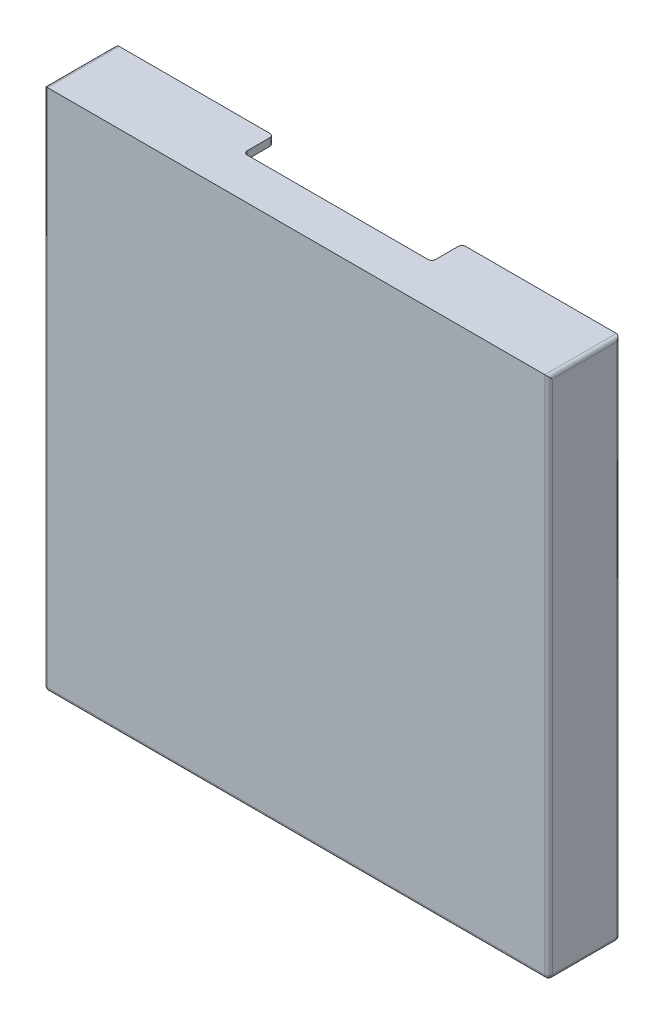
ISO-10303-21;
HEADER;
FILE_DESCRIPTION(('STEP AP214'),'2;1');
FILE_NAME('part.step','',(''),(''),'','','');
FILE_SCHEMA(('AUTOMOTIVE_DESIGN { 1 0 10303 214 1 1 1 1 }'));
ENDSEC;
DATA;
#1=APPLICATION_CONTEXT('core data for automotive mechanical design processes');
#2=APPLICATION_PROTOCOL_DEFINITION('international standard','automotive_design',2000,#1);
#3=PRODUCT_CONTEXT('',#1,'mechanical');
#4=PRODUCT('Part','Part','',(#3));
#5=PRODUCT_RELATED_PRODUCT_CATEGORY('part','',(#4));
#6=PRODUCT_DEFINITION_FORMATION('','',#4);
#7=PRODUCT_DEFINITION_CONTEXT('part definition',#1,'design');
#8=PRODUCT_DEFINITION('design','',#6,#7);
#9=PRODUCT_DEFINITION_SHAPE('','',#8);
#10=(LENGTH_UNIT() NAMED_UNIT(*) SI_UNIT(.MILLI.,.METRE.));
#11=(NAMED_UNIT(*) PLANE_ANGLE_UNIT() SI_UNIT($,.RADIAN.));
#12=(NAMED_UNIT(*) SI_UNIT($,.STERADIAN.) SOLID_ANGLE_UNIT());
#13=UNCERTAINTY_MEASURE_WITH_UNIT(LENGTH_MEASURE(1.E-05),#10,'distance_accuracy_value','');
#14=(GEOMETRIC_REPRESENTATION_CONTEXT(3) GLOBAL_UNCERTAINTY_ASSIGNED_CONTEXT((#13)) GLOBAL_UNIT_ASSIGNED_CONTEXT((#10,
#11,#12)) REPRESENTATION_CONTEXT('',''));
#15=CARTESIAN_POINT('',(0.,0.,0.));
#16=DIRECTION('',(0.,0.,1.));
#17=DIRECTION('',(1.,0.,0.));
#18=AXIS2_PLACEMENT_3D('',#15,#16,#17);
#19=CARTESIAN_POINT('',(-134.,278.,19.));
#20=DIRECTION('',(1.,0.,0.));
#21=DIRECTION('',(0.,0.,-1.));
#22=AXIS2_PLACEMENT_3D('',#19,#20,#21);
#23=PLANE('',#22);
#24=DIRECTION('',(0.,-1.,0.));
#25=VECTOR('',#24,1.);
#26=CARTESIAN_POINT('',(-134.,278.,17.));
#27=LINE('',#26,#25);
#28=CARTESIAN_POINT('',(-134.,2.,17.));
#29=VERTEX_POINT('',#28);
#30=CARTESIAN_POINT('',(-134.,276.,17.));
#31=VERTEX_POINT('',#30);
#32=EDGE_CURVE('E285',#29,#31,#27,.F.);
#33=ORIENTED_EDGE('',*,*,#32,.T.);
#34=DIRECTION('',(0.,0.,1.));
#35=VECTOR('',#34,1.);
#36=CARTESIAN_POINT('',(-134.,276.,-19.));
#37=LINE('',#36,#35);
#38=CARTESIAN_POINT('',(-134.,276.,-17.));
#39=VERTEX_POINT('',#38);
#40=EDGE_CURVE('E291',#31,#39,#37,.F.);
#41=ORIENTED_EDGE('',*,*,#40,.T.);
#42=DIRECTION('',(0.,-1.,0.));
#43=VECTOR('',#42,1.);
#44=CARTESIAN_POINT('',(-134.,278.,-17.));
#45=LINE('',#44,#43);
#46=CARTESIAN_POINT('',(-134.,2.,-17.));
#47=VERTEX_POINT('',#46);
#48=EDGE_CURVE('E288',#39,#47,#45,.T.);
#49=ORIENTED_EDGE('',*,*,#48,.T.);
#50=DIRECTION('',(0.,0.,1.));
#51=VECTOR('',#50,1.);
#52=CARTESIAN_POINT('',(-134.,2.,19.));
#53=LINE('',#52,#51);
#54=EDGE_CURVE('E282',#47,#29,#53,.T.);
#55=ORIENTED_EDGE('',*,*,#54,.T.);
#56=EDGE_LOOP('',(#33,#41,#49,#55));
#57=FACE_BOUND('',#56,.T.);
#58=ADVANCED_FACE('F47',(#57),#23,.F.);
#59=CARTESIAN_POINT('',(134.,278.,19.));
#60=DIRECTION('',(0.,0.,-1.));
#61=DIRECTION('',(-1.,0.,0.));
#62=AXIS2_PLACEMENT_3D('',#59,#60,#61);
#63=PLANE('',#62);
#64=DIRECTION('',(1.,0.,0.));
#65=VECTOR('',#64,1.);
#66=CARTESIAN_POINT('',(134.,278.,19.));
#67=LINE('',#66,#65);
#68=CARTESIAN_POINT('',(-132.,278.,19.));
#69=VERTEX_POINT('',#68);
#70=CARTESIAN_POINT('',(132.,278.,19.));
#71=VERTEX_POINT('',#70);
#72=EDGE_CURVE('E246',#69,#71,#67,.T.);
#73=ORIENTED_EDGE('',*,*,#72,.F.);
#74=DIRECTION('',(0.,-1.,0.));
#75=VECTOR('',#74,1.);
#76=CARTESIAN_POINT('',(-132.,278.,19.));
#77=LINE('',#76,#75);
#78=CARTESIAN_POINT('',(-132.,2.,19.));
#79=VERTEX_POINT('',#78);
#80=EDGE_CURVE('E70',#69,#79,#77,.T.);
#81=ORIENTED_EDGE('',*,*,#80,.T.);
#82=DIRECTION('',(1.,0.,0.));
#83=VECTOR('',#82,1.);
#84=CARTESIAN_POINT('',(134.,2.,19.));
#85=LINE('',#84,#83);
#86=CARTESIAN_POINT('',(132.,2.,19.));
#87=VERTEX_POINT('',#86);
#88=EDGE_CURVE('E65',#79,#87,#85,.T.);
#89=ORIENTED_EDGE('',*,*,#88,.T.);
#90=DIRECTION('',(0.,-1.,0.));
#91=VECTOR('',#90,1.);
#92=CARTESIAN_POINT('',(132.,278.,19.));
#93=LINE('',#92,#91);
#94=EDGE_CURVE('E353',#87,#71,#93,.F.);
#95=ORIENTED_EDGE('',*,*,#94,.T.);
#96=EDGE_LOOP('',(#73,#81,#89,#95));
#97=FACE_BOUND('',#96,.T.);
#98=ADVANCED_FACE('F541',(#97),#63,.F.);
#99=CARTESIAN_POINT('',(134.,278.,19.));
#100=DIRECTION('',(-1.,0.,0.));
#101=DIRECTION('',(0.,0.,1.));
#102=AXIS2_PLACEMENT_3D('',#99,#100,#101);
#103=PLANE('',#102);
#104=DIRECTION('',(0.,-1.,0.));
#105=VECTOR('',#104,1.);
#106=CARTESIAN_POINT('',(134.,278.,-17.));
#107=LINE('',#106,#105);
#108=CARTESIAN_POINT('',(134.,2.,-17.));
#109=VERTEX_POINT('',#108);
#110=CARTESIAN_POINT('',(134.,276.,-17.));
#111=VERTEX_POINT('',#110);
#112=EDGE_CURVE('E275',#109,#111,#107,.F.);
#113=ORIENTED_EDGE('',*,*,#112,.T.);
#114=DIRECTION('',(0.,0.,-1.));
#115=VECTOR('',#114,1.);
#116=CARTESIAN_POINT('',(134.,276.,19.));
#117=LINE('',#116,#115);
#118=CARTESIAN_POINT('',(134.,276.,17.));
#119=VERTEX_POINT('',#118);
#120=EDGE_CURVE('E278',#111,#119,#117,.F.);
#121=ORIENTED_EDGE('',*,*,#120,.T.);
#122=DIRECTION('',(0.,-1.,0.));
#123=VECTOR('',#122,1.);
#124=CARTESIAN_POINT('',(134.,278.,17.));
#125=LINE('',#124,#123);
#126=CARTESIAN_POINT('',(134.,2.,17.));
#127=VERTEX_POINT('',#126);
#128=EDGE_CURVE('E272',#119,#127,#125,.T.);
#129=ORIENTED_EDGE('',*,*,#128,.T.);
#130=DIRECTION('',(0.,0.,-1.));
#131=VECTOR('',#130,1.);
#132=CARTESIAN_POINT('',(134.,2.,19.));
#133=LINE('',#132,#131);
#134=EDGE_CURVE('E269',#127,#109,#133,.T.);
#135=ORIENTED_EDGE('',*,*,#134,.T.);
#136=EDGE_LOOP('',(#113,#121,#129,#135));
#137=FACE_BOUND('',#136,.T.);
#138=ADVANCED_FACE('F559',(#137),#103,.F.);
#139=CARTESIAN_POINT('',(134.,278.,-19.));
#140=DIRECTION('',(0.,0.,1.));
#141=DIRECTION('',(1.,0.,0.));
#142=AXIS2_PLACEMENT_3D('',#139,#140,#141);
#143=PLANE('',#142);
#144=DIRECTION('',(-1.,0.,0.));
#145=VECTOR('',#144,1.);
#146=CARTESIAN_POINT('',(134.,278.,-19.));
#147=LINE('',#146,#145);
#148=CARTESIAN_POINT('',(132.,278.,-19.));
#149=VERTEX_POINT('',#148);
#150=CARTESIAN_POINT('',(52.,278.,-19.));
#151=VERTEX_POINT('',#150);
#152=EDGE_CURVE('E252',#149,#151,#147,.T.);
#153=ORIENTED_EDGE('',*,*,#152,.F.);
#154=DIRECTION('',(0.,-1.,0.));
#155=VECTOR('',#154,1.);
#156=CARTESIAN_POINT('',(132.,278.,-19.));
#157=LINE('',#156,#155);
#158=CARTESIAN_POINT('',(132.,2.,-19.));
#159=VERTEX_POINT('',#158);
#160=EDGE_CURVE('E308',#149,#159,#157,.T.);
#161=ORIENTED_EDGE('',*,*,#160,.T.);
#162=DIRECTION('',(-1.,0.,0.));
#163=VECTOR('',#162,1.);
#164=CARTESIAN_POINT('',(134.,2.,-19.));
#165=LINE('',#164,#163);
#166=CARTESIAN_POINT('',(-132.,2.,-19.));
#167=VERTEX_POINT('',#166);
#168=EDGE_CURVE('E305',#159,#167,#165,.T.);
#169=ORIENTED_EDGE('',*,*,#168,.T.);
#170=DIRECTION('',(0.,-1.,0.));
#171=VECTOR('',#170,1.);
#172=CARTESIAN_POINT('',(-132.,278.,-19.));
#173=LINE('',#172,#171);
#174=CARTESIAN_POINT('',(-132.,278.,-19.));
#175=VERTEX_POINT('',#174);
#176=EDGE_CURVE('E302',#167,#175,#173,.F.);
#177=ORIENTED_EDGE('',*,*,#176,.T.);
#178=CARTESIAN_POINT('',(-52.,278.,-19.));
#179=VERTEX_POINT('',#178);
#180=EDGE_CURVE('E251',#179,#175,#147,.T.);
#181=ORIENTED_EDGE('',*,*,#180,.F.);
#182=DIRECTION('',(0.,1.,0.));
#183=VECTOR('',#182,1.);
#184=CARTESIAN_POINT('',(-52.,278.,-19.));
#185=LINE('',#184,#183);
#186=CARTESIAN_POINT('',(-52.,274.,-19.));
#187=VERTEX_POINT('',#186);
#188=EDGE_CURVE('E295',#179,#187,#185,.F.);
#189=ORIENTED_EDGE('',*,*,#188,.T.);
#190=DIRECTION('',(1.,0.,0.));
#191=VECTOR('',#190,1.);
#192=CARTESIAN_POINT('',(-130.,274.,-19.));
#193=LINE('',#192,#191);
#194=CARTESIAN_POINT('',(-130.,274.,-19.));
#195=VERTEX_POINT('',#194);
#196=EDGE_CURVE('E226',#195,#187,#193,.T.);
#197=ORIENTED_EDGE('',*,*,#196,.F.);
#198=DIRECTION('',(0.,1.,0.));
#199=VECTOR('',#198,1.);
#200=CARTESIAN_POINT('',(-130.,4.,-19.));
#201=LINE('',#200,#199);
#202=CARTESIAN_POINT('',(-130.,4.,-19.));
#203=VERTEX_POINT('',#202);
#204=EDGE_CURVE('E203',#203,#195,#201,.T.);
#205=ORIENTED_EDGE('',*,*,#204,.F.);
#206=DIRECTION('',(-1.,0.,0.));
#207=VECTOR('',#206,1.);
#208=CARTESIAN_POINT('',(130.,4.,-19.));
#209=LINE('',#208,#207);
#210=CARTESIAN_POINT('',(130.,4.,-19.));
#211=VERTEX_POINT('',#210);
#212=EDGE_CURVE('E215',#211,#203,#209,.T.);
#213=ORIENTED_EDGE('',*,*,#212,.F.);
#214=DIRECTION('',(0.,-1.,0.));
#215=VECTOR('',#214,1.);
#216=CARTESIAN_POINT('',(130.,274.,-19.));
#217=LINE('',#216,#215);
#218=CARTESIAN_POINT('',(130.,274.,-19.));
#219=VERTEX_POINT('',#218);
#220=EDGE_CURVE('E221',#219,#211,#217,.T.);
#221=ORIENTED_EDGE('',*,*,#220,.F.);
#222=CARTESIAN_POINT('',(52.,274.,-19.));
#223=VERTEX_POINT('',#222);
#224=EDGE_CURVE('E228',#223,#219,#193,.T.);
#225=ORIENTED_EDGE('',*,*,#224,.F.);
#226=DIRECTION('',(0.,1.,0.));
#227=VECTOR('',#226,1.);
#228=CARTESIAN_POINT('',(52.,278.,-19.));
#229=LINE('',#228,#227);
#230=EDGE_CURVE('E298',#223,#151,#229,.T.);
#231=ORIENTED_EDGE('',*,*,#230,.T.);
#232=EDGE_LOOP('',(#153,#161,#169,#177,#181,#189,#197,#205,#213,#221,#225,#231));
#233=FACE_BOUND('',#232,.T.);
#234=ADVANCED_FACE('F224',(#233),#143,.F.);
#235=CARTESIAN_POINT('',(0.,278.,0.));
#236=DIRECTION('',(0.,1.,0.));
#237=DIRECTION('',(0.,0.,1.));
#238=AXIS2_PLACEMENT_3D('',#235,#236,#237);
#239=PLANE('',#238);
#240=ORIENTED_EDGE('',*,*,#72,.T.);
#241=DIRECTION('',(0.,0.,-1.));
#242=VECTOR('',#241,1.);
#243=CARTESIAN_POINT('',(132.,278.,-19.));
#244=LINE('',#243,#242);
#245=EDGE_CURVE('E265',#71,#149,#244,.T.);
#246=ORIENTED_EDGE('',*,*,#245,.T.);
#247=ORIENTED_EDGE('',*,*,#152,.T.);
#248=CARTESIAN_POINT('',(52.,278.,-17.));
#249=DIRECTION('',(0.,1.,0.));
#250=DIRECTION('',(0.,0.,1.));
#251=AXIS2_PLACEMENT_3D('',#248,#249,#250);
#252=CIRCLE('',#251,2.);
#253=CARTESIAN_POINT('',(50.,278.,-17.));
#254=VERTEX_POINT('',#253);
#255=EDGE_CURVE('E259',#151,#254,#252,.T.);
#256=ORIENTED_EDGE('',*,*,#255,.T.);
#257=DIRECTION('',(0.,0.,-1.));
#258=VECTOR('',#257,1.);
#259=CARTESIAN_POINT('',(50.,278.,-19.));
#260=LINE('',#259,#258);
#261=CARTESIAN_POINT('',(50.,278.,-4.99999999999997));
#262=VERTEX_POINT('',#261);
#263=EDGE_CURVE('E449',#262,#254,#260,.T.);
#264=ORIENTED_EDGE('',*,*,#263,.F.);
#265=CARTESIAN_POINT('',(48.,278.,-4.99999999999998));
#266=DIRECTION('',(0.,1.,0.));
#267=DIRECTION('',(0.,0.,1.));
#268=AXIS2_PLACEMENT_3D('',#265,#266,#267);
#269=CIRCLE('',#268,2.);
#270=CARTESIAN_POINT('',(48.,278.,-2.99999999999998));
#271=VERTEX_POINT('',#270);
#272=EDGE_CURVE('E57',#262,#271,#269,.F.);
#273=ORIENTED_EDGE('',*,*,#272,.T.);
#274=DIRECTION('',(1.,0.,0.));
#275=VECTOR('',#274,1.);
#276=CARTESIAN_POINT('',(-50.,278.,-2.99999999999999));
#277=LINE('',#276,#275);
#278=CARTESIAN_POINT('',(-48.,278.,-2.99999999999999));
#279=VERTEX_POINT('',#278);
#280=EDGE_CURVE('E445',#279,#271,#277,.T.);
#281=ORIENTED_EDGE('',*,*,#280,.F.);
#282=CARTESIAN_POINT('',(-48.,278.,-4.99999999999999));
#283=DIRECTION('',(0.,1.,0.));
#284=DIRECTION('',(0.,0.,1.));
#285=AXIS2_PLACEMENT_3D('',#282,#283,#284);
#286=CIRCLE('',#285,2.);
#287=CARTESIAN_POINT('',(-50.,278.,-4.99999999999999));
#288=VERTEX_POINT('',#287);
#289=EDGE_CURVE('E358',#279,#288,#286,.F.);
#290=ORIENTED_EDGE('',*,*,#289,.T.);
#291=DIRECTION('',(0.,0.,1.));
#292=VECTOR('',#291,1.);
#293=CARTESIAN_POINT('',(-50.,278.,-19.));
#294=LINE('',#293,#292);
#295=CARTESIAN_POINT('',(-50.,278.,-17.));
#296=VERTEX_POINT('',#295);
#297=EDGE_CURVE('E439',#296,#288,#294,.T.);
#298=ORIENTED_EDGE('',*,*,#297,.F.);
#299=CARTESIAN_POINT('',(-52.,278.,-17.));
#300=DIRECTION('',(0.,1.,0.));
#301=DIRECTION('',(0.,0.,1.));
#302=AXIS2_PLACEMENT_3D('',#299,#300,#301);
#303=CIRCLE('',#302,2.);
#304=EDGE_CURVE('E256',#296,#179,#303,.T.);
#305=ORIENTED_EDGE('',*,*,#304,.T.);
#306=ORIENTED_EDGE('',*,*,#180,.T.);
#307=DIRECTION('',(0.,0.,1.));
#308=VECTOR('',#307,1.);
#309=CARTESIAN_POINT('',(-132.,278.,19.));
#310=LINE('',#309,#308);
#311=EDGE_CURVE('E262',#175,#69,#310,.T.);
#312=ORIENTED_EDGE('',*,*,#311,.T.);
#313=EDGE_LOOP('',(#240,#246,#247,#256,#264,#273,#281,#290,#298,#305,#306,#312));
#314=FACE_BOUND('',#313,.T.);
#315=ADVANCED_FACE('F476',(#314),#239,.T.);
#316=CARTESIAN_POINT('',(0.,0.,0.));
#317=DIRECTION('',(0.,1.,0.));
#318=DIRECTION('',(0.,0.,1.));
#319=AXIS2_PLACEMENT_3D('',#316,#317,#318);
#320=PLANE('',#319);
#321=DIRECTION('',(-1.,0.,0.));
#322=VECTOR('',#321,1.);
#323=CARTESIAN_POINT('',(0.,0.,-17.));
#324=LINE('',#323,#322);
#325=CARTESIAN_POINT('',(-132.,0.,-17.));
#326=VERTEX_POINT('',#325);
#327=CARTESIAN_POINT('',(132.,0.,-17.));
#328=VERTEX_POINT('',#327);
#329=EDGE_CURVE('E317',#326,#328,#324,.F.);
#330=ORIENTED_EDGE('',*,*,#329,.T.);
#331=DIRECTION('',(0.,0.,-1.));
#332=VECTOR('',#331,1.);
#333=CARTESIAN_POINT('',(132.,0.,0.));
#334=LINE('',#333,#332);
#335=CARTESIAN_POINT('',(132.,0.,17.));
#336=VERTEX_POINT('',#335);
#337=EDGE_CURVE('E321',#328,#336,#334,.F.);
#338=ORIENTED_EDGE('',*,*,#337,.T.);
#339=DIRECTION('',(1.,0.,0.));
#340=VECTOR('',#339,1.);
#341=CARTESIAN_POINT('',(0.,0.,17.));
#342=LINE('',#341,#340);
#343=CARTESIAN_POINT('',(-132.,0.,17.));
#344=VERTEX_POINT('',#343);
#345=EDGE_CURVE('E314',#336,#344,#342,.F.);
#346=ORIENTED_EDGE('',*,*,#345,.T.);
#347=DIRECTION('',(0.,0.,1.));
#348=VECTOR('',#347,1.);
#349=CARTESIAN_POINT('',(-132.,0.,0.));
#350=LINE('',#349,#348);
#351=EDGE_CURVE('E311',#344,#326,#350,.F.);
#352=ORIENTED_EDGE('',*,*,#351,.T.);
#353=EDGE_LOOP('',(#330,#338,#346,#352));
#354=FACE_BOUND('',#353,.T.);
#355=ADVANCED_FACE('F516',(#354),#320,.F.);
#356=CARTESIAN_POINT('',(130.,274.,393.833296279826));
#357=DIRECTION('',(1.,0.,0.));
#358=DIRECTION('',(0.,0.,-1.));
#359=AXIS2_PLACEMENT_3D('',#356,#357,#358);
#360=PLANE('',#359);
#361=DIRECTION('',(0.,1.,0.));
#362=VECTOR('',#361,1.);
#363=CARTESIAN_POINT('',(130.,274.,17.));
#364=LINE('',#363,#362);
#365=CARTESIAN_POINT('',(130.,4.,17.));
#366=VERTEX_POINT('',#365);
#367=CARTESIAN_POINT('',(130.,274.,17.));
#368=VERTEX_POINT('',#367);
#369=EDGE_CURVE('E247',#366,#368,#364,.T.);
#370=ORIENTED_EDGE('',*,*,#369,.T.);
#371=DIRECTION('',(0.,0.,-1.));
#372=VECTOR('',#371,1.);
#373=CARTESIAN_POINT('',(130.,274.,393.833296279826));
#374=LINE('',#373,#372);
#375=EDGE_CURVE('E235',#368,#219,#374,.T.);
#376=ORIENTED_EDGE('',*,*,#375,.T.);
#377=ORIENTED_EDGE('',*,*,#220,.T.);
#378=DIRECTION('',(0.,0.,-1.));
#379=VECTOR('',#378,1.);
#380=CARTESIAN_POINT('',(130.,4.,393.833296279826));
#381=LINE('',#380,#379);
#382=EDGE_CURVE('E211',#366,#211,#381,.T.);
#383=ORIENTED_EDGE('',*,*,#382,.F.);
#384=EDGE_LOOP('',(#370,#376,#377,#383));
#385=FACE_BOUND('',#384,.T.);
#386=ADVANCED_FACE('F465',(#385),#360,.F.);
#387=CARTESIAN_POINT('',(-130.,274.,393.833296279826));
#388=DIRECTION('',(0.,1.,0.));
#389=DIRECTION('',(0.,0.,1.));
#390=AXIS2_PLACEMENT_3D('',#387,#388,#389);
#391=PLANE('',#390);
#392=DIRECTION('',(0.,0.,1.));
#393=VECTOR('',#392,1.);
#394=CARTESIAN_POINT('',(50.,274.,-19.));
#395=LINE('',#394,#393);
#396=CARTESIAN_POINT('',(50.,274.,-17.));
#397=VERTEX_POINT('',#396);
#398=CARTESIAN_POINT('',(50.,274.,-4.99999999999997));
#399=VERTEX_POINT('',#398);
#400=EDGE_CURVE('E426',#397,#399,#395,.T.);
#401=ORIENTED_EDGE('',*,*,#400,.F.);
#402=CARTESIAN_POINT('',(52.,274.,-17.));
#403=DIRECTION('',(0.,1.,0.));
#404=DIRECTION('',(0.,0.,1.));
#405=AXIS2_PLACEMENT_3D('',#402,#403,#404);
#406=CIRCLE('',#405,2.);
#407=EDGE_CURVE('E348',#397,#223,#406,.F.);
#408=ORIENTED_EDGE('',*,*,#407,.T.);
#409=ORIENTED_EDGE('',*,*,#224,.T.);
#410=ORIENTED_EDGE('',*,*,#375,.F.);
#411=DIRECTION('',(-1.,0.,0.));
#412=VECTOR('',#411,1.);
#413=CARTESIAN_POINT('',(-130.,274.,17.));
#414=LINE('',#413,#412);
#415=CARTESIAN_POINT('',(-130.,274.,17.));
#416=VERTEX_POINT('',#415);
#417=EDGE_CURVE('E459',#368,#416,#414,.T.);
#418=ORIENTED_EDGE('',*,*,#417,.T.);
#419=DIRECTION('',(0.,0.,-1.));
#420=VECTOR('',#419,1.);
#421=CARTESIAN_POINT('',(-130.,274.,393.833296279826));
#422=LINE('',#421,#420);
#423=EDGE_CURVE('E210',#416,#195,#422,.T.);
#424=ORIENTED_EDGE('',*,*,#423,.T.);
#425=ORIENTED_EDGE('',*,*,#196,.T.);
#426=CARTESIAN_POINT('',(-52.,274.,-17.));
#427=DIRECTION('',(0.,1.,0.));
#428=DIRECTION('',(0.,0.,1.));
#429=AXIS2_PLACEMENT_3D('',#426,#427,#428);
#430=CIRCLE('',#429,2.);
#431=CARTESIAN_POINT('',(-50.,274.,-17.));
#432=VERTEX_POINT('',#431);
#433=EDGE_CURVE('E345',#187,#432,#430,.F.);
#434=ORIENTED_EDGE('',*,*,#433,.T.);
#435=DIRECTION('',(0.,0.,-1.));
#436=VECTOR('',#435,1.);
#437=CARTESIAN_POINT('',(-50.,274.,-19.));
#438=LINE('',#437,#436);
#439=CARTESIAN_POINT('',(-50.,274.,-4.99999999999999));
#440=VERTEX_POINT('',#439);
#441=EDGE_CURVE('E432',#440,#432,#438,.T.);
#442=ORIENTED_EDGE('',*,*,#441,.F.);
#443=CARTESIAN_POINT('',(-48.,274.,-4.99999999999999));
#444=DIRECTION('',(0.,1.,0.));
#445=DIRECTION('',(0.,0.,1.));
#446=AXIS2_PLACEMENT_3D('',#443,#444,#445);
#447=CIRCLE('',#446,2.);
#448=CARTESIAN_POINT('',(-48.,274.,-2.99999999999999));
#449=VERTEX_POINT('',#448);
#450=EDGE_CURVE('E361',#440,#449,#447,.T.);
#451=ORIENTED_EDGE('',*,*,#450,.T.);
#452=DIRECTION('',(-1.,0.,0.));
#453=VECTOR('',#452,1.);
#454=CARTESIAN_POINT('',(-50.,274.,-2.99999999999999));
#455=LINE('',#454,#453);
#456=CARTESIAN_POINT('',(48.,274.,-2.99999999999998));
#457=VERTEX_POINT('',#456);
#458=EDGE_CURVE('E453',#457,#449,#455,.T.);
#459=ORIENTED_EDGE('',*,*,#458,.F.);
#460=CARTESIAN_POINT('',(48.,274.,-4.99999999999998));
#461=DIRECTION('',(0.,1.,0.));
#462=DIRECTION('',(0.,0.,1.));
#463=AXIS2_PLACEMENT_3D('',#460,#461,#462);
#464=CIRCLE('',#463,2.);
#465=EDGE_CURVE('E12',#457,#399,#464,.T.);
#466=ORIENTED_EDGE('',*,*,#465,.T.);
#467=EDGE_LOOP('',(#401,#408,#409,#410,#418,#424,#425,#434,#442,#451,#459,#466));
#468=FACE_BOUND('',#467,.T.);
#469=ADVANCED_FACE('F744',(#468),#391,.F.);
#470=CARTESIAN_POINT('',(-130.,4.,393.833296279826));
#471=DIRECTION('',(-1.,0.,0.));
#472=DIRECTION('',(0.,0.,1.));
#473=AXIS2_PLACEMENT_3D('',#470,#471,#472);
#474=PLANE('',#473);
#475=DIRECTION('',(0.,-1.,0.));
#476=VECTOR('',#475,1.);
#477=CARTESIAN_POINT('',(-130.,4.,17.));
#478=LINE('',#477,#476);
#479=CARTESIAN_POINT('',(-130.,4.,17.));
#480=VERTEX_POINT('',#479);
#481=EDGE_CURVE('E206',#416,#480,#478,.T.);
#482=ORIENTED_EDGE('',*,*,#481,.T.);
#483=DIRECTION('',(0.,0.,-1.));
#484=VECTOR('',#483,1.);
#485=CARTESIAN_POINT('',(-130.,4.,393.833296279826));
#486=LINE('',#485,#484);
#487=EDGE_CURVE('E198',#480,#203,#486,.T.);
#488=ORIENTED_EDGE('',*,*,#487,.T.);
#489=ORIENTED_EDGE('',*,*,#204,.T.);
#490=ORIENTED_EDGE('',*,*,#423,.F.);
#491=EDGE_LOOP('',(#482,#488,#489,#490));
#492=FACE_BOUND('',#491,.T.);
#493=ADVANCED_FACE('F200',(#492),#474,.F.);
#494=CARTESIAN_POINT('',(130.,4.,393.833296279826));
#495=DIRECTION('',(0.,-1.,0.));
#496=DIRECTION('',(0.,0.,-1.));
#497=AXIS2_PLACEMENT_3D('',#494,#495,#496);
#498=PLANE('',#497);
#499=DIRECTION('',(1.,0.,0.));
#500=VECTOR('',#499,1.);
#501=CARTESIAN_POINT('',(130.,4.,17.));
#502=LINE('',#501,#500);
#503=EDGE_CURVE('E243',#480,#366,#502,.T.);
#504=ORIENTED_EDGE('',*,*,#503,.T.);
#505=ORIENTED_EDGE('',*,*,#382,.T.);
#506=ORIENTED_EDGE('',*,*,#212,.T.);
#507=ORIENTED_EDGE('',*,*,#487,.F.);
#508=EDGE_LOOP('',(#504,#505,#506,#507));
#509=FACE_BOUND('',#508,.T.);
#510=ADVANCED_FACE('F216',(#509),#498,.F.);
#511=CARTESIAN_POINT('',(134.,278.,17.));
#512=DIRECTION('',(0.,0.,-1.));
#513=DIRECTION('',(-1.,0.,0.));
#514=AXIS2_PLACEMENT_3D('',#511,#512,#513);
#515=PLANE('',#514);
#516=ORIENTED_EDGE('',*,*,#369,.F.);
#517=ORIENTED_EDGE('',*,*,#503,.F.);
#518=ORIENTED_EDGE('',*,*,#481,.F.);
#519=ORIENTED_EDGE('',*,*,#417,.F.);
#520=EDGE_LOOP('',(#516,#517,#518,#519));
#521=FACE_BOUND('',#520,.T.);
#522=ADVANCED_FACE('F722',(#521),#515,.T.);
#523=CARTESIAN_POINT('',(-50.,-0.000999999999973245,-19.));
#524=DIRECTION('',(-1.,0.,0.));
#525=DIRECTION('',(0.,0.,1.));
#526=AXIS2_PLACEMENT_3D('',#523,#524,#525);
#527=PLANE('',#526);
#528=ORIENTED_EDGE('',*,*,#297,.T.);
#529=DIRECTION('',(0.,1.,0.));
#530=VECTOR('',#529,1.);
#531=CARTESIAN_POINT('',(-50.,274.,-4.99999999999999));
#532=LINE('',#531,#530);
#533=EDGE_CURVE('E335',#288,#440,#532,.F.);
#534=ORIENTED_EDGE('',*,*,#533,.T.);
#535=ORIENTED_EDGE('',*,*,#441,.T.);
#536=DIRECTION('',(0.,1.,0.));
#537=VECTOR('',#536,1.);
#538=CARTESIAN_POINT('',(-50.,-0.000999999999973245,-17.));
#539=LINE('',#538,#537);
#540=EDGE_CURVE('E331',#432,#296,#539,.T.);
#541=ORIENTED_EDGE('',*,*,#540,.T.);
#542=EDGE_LOOP('',(#528,#534,#535,#541));
#543=FACE_BOUND('',#542,.T.);
#544=ADVANCED_FACE('F493',(#543),#527,.F.);
#545=CARTESIAN_POINT('',(50.,-0.000999999999973245,-19.));
#546=DIRECTION('',(1.,0.,0.));
#547=DIRECTION('',(0.,0.,-1.));
#548=AXIS2_PLACEMENT_3D('',#545,#546,#547);
#549=PLANE('',#548);
#550=ORIENTED_EDGE('',*,*,#400,.T.);
#551=DIRECTION('',(0.,1.,0.));
#552=VECTOR('',#551,1.);
#553=CARTESIAN_POINT('',(50.,278.,-4.99999999999997));
#554=LINE('',#553,#552);
#555=EDGE_CURVE('E341',#399,#262,#554,.T.);
#556=ORIENTED_EDGE('',*,*,#555,.T.);
#557=ORIENTED_EDGE('',*,*,#263,.T.);
#558=DIRECTION('',(0.,1.,0.));
#559=VECTOR('',#558,1.);
#560=CARTESIAN_POINT('',(50.,-0.000999999999973245,-17.));
#561=LINE('',#560,#559);
#562=EDGE_CURVE('E338',#254,#397,#561,.F.);
#563=ORIENTED_EDGE('',*,*,#562,.T.);
#564=EDGE_LOOP('',(#550,#556,#557,#563));
#565=FACE_BOUND('',#564,.T.);
#566=ADVANCED_FACE('F477',(#565),#549,.F.);
#567=CARTESIAN_POINT('',(-50.,-0.000999999999973245,-2.99999999999999));
#568=DIRECTION('',(0.,0.,1.));
#569=DIRECTION('',(1.,0.,0.));
#570=AXIS2_PLACEMENT_3D('',#567,#568,#569);
#571=PLANE('',#570);
#572=ORIENTED_EDGE('',*,*,#458,.T.);
#573=DIRECTION('',(0.,1.,0.));
#574=VECTOR('',#573,1.);
#575=CARTESIAN_POINT('',(-48.,278.,-2.99999999999999));
#576=LINE('',#575,#574);
#577=EDGE_CURVE('E327',#449,#279,#576,.T.);
#578=ORIENTED_EDGE('',*,*,#577,.T.);
#579=ORIENTED_EDGE('',*,*,#280,.T.);
#580=DIRECTION('',(0.,1.,0.));
#581=VECTOR('',#580,1.);
#582=CARTESIAN_POINT('',(48.,274.,-2.99999999999998));
#583=LINE('',#582,#581);
#584=EDGE_CURVE('E324',#271,#457,#583,.F.);
#585=ORIENTED_EDGE('',*,*,#584,.T.);
#586=EDGE_LOOP('',(#572,#578,#579,#585));
#587=FACE_BOUND('',#586,.T.);
#588=ADVANCED_FACE('F484',(#587),#571,.F.);
#589=CARTESIAN_POINT('',(-132.,276.,0.));
#590=DIRECTION('',(0.,0.,-1.));
#591=DIRECTION('',(-1.,0.,0.));
#592=AXIS2_PLACEMENT_3D('',#589,#590,#591);
#593=CYLINDRICAL_SURFACE('',#592,2.);
#594=CARTESIAN_POINT('',(-132.,276.,-17.));
#595=DIRECTION('',(0.,-0.707106781186547,-0.707106781186547));
#596=DIRECTION('',(0.,-0.707106781186547,0.707106781186547));
#597=AXIS2_PLACEMENT_3D('',#594,#595,#596);
#598=ELLIPSE('',#597,2.82842712474619,2.);
#599=EDGE_CURVE('E418',#39,#175,#598,.T.);
#600=ORIENTED_EDGE('',*,*,#599,.F.);
#601=ORIENTED_EDGE('',*,*,#40,.F.);
#602=CARTESIAN_POINT('',(-132.,276.,17.));
#603=DIRECTION('',(0.,-0.707106781186547,0.707106781186547));
#604=DIRECTION('',(0.,-0.707106781186547,-0.707106781186547));
#605=AXIS2_PLACEMENT_3D('',#602,#603,#604);
#606=ELLIPSE('',#605,2.82842712474619,2.);
#607=EDGE_CURVE('E51',#69,#31,#606,.T.);
#608=ORIENTED_EDGE('',*,*,#607,.F.);
#609=ORIENTED_EDGE('',*,*,#311,.F.);
#610=EDGE_LOOP('',(#600,#601,#608,#609));
#611=FACE_BOUND('',#610,.T.);
#612=ADVANCED_FACE('F543',(#611),#593,.T.);
#613=CARTESIAN_POINT('',(-132.,278.,17.));
#614=DIRECTION('',(0.,-1.,0.));
#615=DIRECTION('',(0.,0.,-1.));
#616=AXIS2_PLACEMENT_3D('',#613,#614,#615);
#617=CYLINDRICAL_SURFACE('',#616,2.);
#618=ORIENTED_EDGE('',*,*,#607,.T.);
#619=ORIENTED_EDGE('',*,*,#32,.F.);
#620=CARTESIAN_POINT('',(-132.,2.,17.));
#621=DIRECTION('',(0.,-1.,0.));
#622=DIRECTION('',(0.,0.,-1.));
#623=AXIS2_PLACEMENT_3D('',#620,#621,#622);
#624=CIRCLE('',#623,2.);
#625=EDGE_CURVE('E411',#79,#29,#624,.T.);
#626=ORIENTED_EDGE('',*,*,#625,.F.);
#627=ORIENTED_EDGE('',*,*,#80,.F.);
#628=EDGE_LOOP('',(#618,#619,#626,#627));
#629=FACE_BOUND('',#628,.T.);
#630=ADVANCED_FACE('F525',(#629),#617,.T.);
#631=CARTESIAN_POINT('',(-132.,278.,-17.));
#632=DIRECTION('',(0.,-1.,0.));
#633=DIRECTION('',(0.,0.,-1.));
#634=AXIS2_PLACEMENT_3D('',#631,#632,#633);
#635=CYLINDRICAL_SURFACE('',#634,2.);
#636=ORIENTED_EDGE('',*,*,#599,.T.);
#637=ORIENTED_EDGE('',*,*,#176,.F.);
#638=CARTESIAN_POINT('',(-132.,2.,-17.));
#639=DIRECTION('',(0.,-1.,0.));
#640=DIRECTION('',(0.,0.,-1.));
#641=AXIS2_PLACEMENT_3D('',#638,#639,#640);
#642=CIRCLE('',#641,2.);
#643=EDGE_CURVE('E407',#47,#167,#642,.T.);
#644=ORIENTED_EDGE('',*,*,#643,.F.);
#645=ORIENTED_EDGE('',*,*,#48,.F.);
#646=EDGE_LOOP('',(#636,#637,#644,#645));
#647=FACE_BOUND('',#646,.T.);
#648=ADVANCED_FACE('F505',(#647),#635,.T.);
#649=CARTESIAN_POINT('',(-132.,2.,19.));
#650=DIRECTION('',(0.,0.,1.));
#651=DIRECTION('',(1.,0.,0.));
#652=AXIS2_PLACEMENT_3D('',#649,#650,#651);
#653=CYLINDRICAL_SURFACE('',#652,2.);
#654=CARTESIAN_POINT('',(-132.,2.,17.));
#655=DIRECTION('',(0.,0.,1.));
#656=DIRECTION('',(1.,0.,0.));
#657=AXIS2_PLACEMENT_3D('',#654,#655,#656);
#658=CIRCLE('',#657,2.);
#659=EDGE_CURVE('E415',#29,#344,#658,.T.);
#660=ORIENTED_EDGE('',*,*,#659,.F.);
#661=ORIENTED_EDGE('',*,*,#54,.F.);
#662=CARTESIAN_POINT('',(-132.,2.,-17.));
#663=DIRECTION('',(0.,0.,-1.));
#664=DIRECTION('',(-1.,0.,0.));
#665=AXIS2_PLACEMENT_3D('',#662,#663,#664);
#666=CIRCLE('',#665,2.);
#667=EDGE_CURVE('E403',#326,#47,#666,.T.);
#668=ORIENTED_EDGE('',*,*,#667,.F.);
#669=ORIENTED_EDGE('',*,*,#351,.F.);
#670=EDGE_LOOP('',(#660,#661,#668,#669));
#671=FACE_BOUND('',#670,.T.);
#672=ADVANCED_FACE('F522',(#671),#653,.T.);
#673=CARTESIAN_POINT('',(-132.,2.,17.));
#674=DIRECTION('',(-1.,0.,0.));
#675=DIRECTION('',(0.,-1.,0.));
#676=AXIS2_PLACEMENT_3D('',#673,#674,#675);
#677=SPHERICAL_SURFACE('',#676,2.);
#678=ORIENTED_EDGE('',*,*,#625,.T.);
#679=ORIENTED_EDGE('',*,*,#659,.T.);
#680=CARTESIAN_POINT('',(-132.,2.,17.));
#681=DIRECTION('',(-1.,0.,0.));
#682=DIRECTION('',(0.,0.,1.));
#683=AXIS2_PLACEMENT_3D('',#680,#681,#682);
#684=CIRCLE('',#683,2.);
#685=EDGE_CURVE('E399',#79,#344,#684,.F.);
#686=ORIENTED_EDGE('',*,*,#685,.F.);
#687=EDGE_LOOP('',(#678,#679,#686));
#688=FACE_BOUND('',#687,.T.);
#689=ADVANCED_FACE('F528',(#688),#677,.T.);
#690=CARTESIAN_POINT('',(-132.,2.,-17.));
#691=DIRECTION('',(-1.,0.,0.));
#692=DIRECTION('',(0.,0.,1.));
#693=AXIS2_PLACEMENT_3D('',#690,#691,#692);
#694=SPHERICAL_SURFACE('',#693,2.);
#695=ORIENTED_EDGE('',*,*,#667,.T.);
#696=ORIENTED_EDGE('',*,*,#643,.T.);
#697=CARTESIAN_POINT('',(-132.,2.,-17.));
#698=DIRECTION('',(-1.,0.,0.));
#699=DIRECTION('',(0.,0.,1.));
#700=AXIS2_PLACEMENT_3D('',#697,#698,#699);
#701=CIRCLE('',#700,2.);
#702=EDGE_CURVE('E395',#326,#167,#701,.F.);
#703=ORIENTED_EDGE('',*,*,#702,.F.);
#704=EDGE_LOOP('',(#695,#696,#703));
#705=FACE_BOUND('',#704,.T.);
#706=ADVANCED_FACE('F508',(#705),#694,.T.);
#707=CARTESIAN_POINT('',(134.,2.,17.));
#708=DIRECTION('',(1.,0.,0.));
#709=DIRECTION('',(0.,0.,-1.));
#710=AXIS2_PLACEMENT_3D('',#707,#708,#709);
#711=CYLINDRICAL_SURFACE('',#710,2.);
#712=ORIENTED_EDGE('',*,*,#685,.T.);
#713=ORIENTED_EDGE('',*,*,#345,.F.);
#714=CARTESIAN_POINT('',(132.,2.,17.));
#715=DIRECTION('',(1.,0.,0.));
#716=DIRECTION('',(0.,0.,-1.));
#717=AXIS2_PLACEMENT_3D('',#714,#715,#716);
#718=CIRCLE('',#717,2.);
#719=EDGE_CURVE('E387',#87,#336,#718,.T.);
#720=ORIENTED_EDGE('',*,*,#719,.F.);
#721=ORIENTED_EDGE('',*,*,#88,.F.);
#722=EDGE_LOOP('',(#712,#713,#720,#721));
#723=FACE_BOUND('',#722,.T.);
#724=ADVANCED_FACE('F530',(#723),#711,.T.);
#725=CARTESIAN_POINT('',(134.,2.,-17.));
#726=DIRECTION('',(-1.,0.,0.));
#727=DIRECTION('',(0.,0.,1.));
#728=AXIS2_PLACEMENT_3D('',#725,#726,#727);
#729=CYLINDRICAL_SURFACE('',#728,2.);
#730=ORIENTED_EDGE('',*,*,#702,.T.);
#731=ORIENTED_EDGE('',*,*,#168,.F.);
#732=CARTESIAN_POINT('',(132.,2.,-17.));
#733=DIRECTION('',(1.,0.,0.));
#734=DIRECTION('',(0.,0.,-1.));
#735=AXIS2_PLACEMENT_3D('',#732,#733,#734);
#736=CIRCLE('',#735,2.);
#737=EDGE_CURVE('E383',#328,#159,#736,.T.);
#738=ORIENTED_EDGE('',*,*,#737,.F.);
#739=ORIENTED_EDGE('',*,*,#329,.F.);
#740=EDGE_LOOP('',(#730,#731,#738,#739));
#741=FACE_BOUND('',#740,.T.);
#742=ADVANCED_FACE('F512',(#741),#729,.T.);
#743=CARTESIAN_POINT('',(132.,2.,19.));
#744=DIRECTION('',(0.,0.,-1.));
#745=DIRECTION('',(-1.,0.,0.));
#746=AXIS2_PLACEMENT_3D('',#743,#744,#745);
#747=CYLINDRICAL_SURFACE('',#746,2.);
#748=CARTESIAN_POINT('',(132.,2.,17.));
#749=DIRECTION('',(0.,0.,1.));
#750=DIRECTION('',(1.,0.,0.));
#751=AXIS2_PLACEMENT_3D('',#748,#749,#750);
#752=CIRCLE('',#751,2.);
#753=EDGE_CURVE('E391',#336,#127,#752,.T.);
#754=ORIENTED_EDGE('',*,*,#753,.F.);
#755=ORIENTED_EDGE('',*,*,#337,.F.);
#756=CARTESIAN_POINT('',(132.,2.,-17.));
#757=DIRECTION('',(0.,0.,-1.));
#758=DIRECTION('',(-1.,0.,0.));
#759=AXIS2_PLACEMENT_3D('',#756,#757,#758);
#760=CIRCLE('',#759,2.);
#761=EDGE_CURVE('E380',#109,#328,#760,.T.);
#762=ORIENTED_EDGE('',*,*,#761,.F.);
#763=ORIENTED_EDGE('',*,*,#134,.F.);
#764=EDGE_LOOP('',(#754,#755,#762,#763));
#765=FACE_BOUND('',#764,.T.);
#766=ADVANCED_FACE('F579',(#765),#747,.T.);
#767=CARTESIAN_POINT('',(132.,2.,17.));
#768=DIRECTION('',(0.,-1.,0.));
#769=DIRECTION('',(0.,0.,-1.));
#770=AXIS2_PLACEMENT_3D('',#767,#768,#769);
#771=SPHERICAL_SURFACE('',#770,2.);
#772=ORIENTED_EDGE('',*,*,#719,.T.);
#773=ORIENTED_EDGE('',*,*,#753,.T.);
#774=CARTESIAN_POINT('',(132.,2.,17.));
#775=DIRECTION('',(0.,-1.,0.));
#776=DIRECTION('',(0.,0.,-1.));
#777=AXIS2_PLACEMENT_3D('',#774,#775,#776);
#778=CIRCLE('',#777,2.);
#779=EDGE_CURVE('E376',#87,#127,#778,.F.);
#780=ORIENTED_EDGE('',*,*,#779,.F.);
#781=EDGE_LOOP('',(#772,#773,#780));
#782=FACE_BOUND('',#781,.T.);
#783=ADVANCED_FACE('F535',(#782),#771,.T.);
#784=CARTESIAN_POINT('',(132.,2.,-17.));
#785=DIRECTION('',(0.,-1.,0.));
#786=DIRECTION('',(0.,0.,-1.));
#787=AXIS2_PLACEMENT_3D('',#784,#785,#786);
#788=SPHERICAL_SURFACE('',#787,2.);
#789=ORIENTED_EDGE('',*,*,#761,.T.);
#790=ORIENTED_EDGE('',*,*,#737,.T.);
#791=CARTESIAN_POINT('',(132.,2.,-17.));
#792=DIRECTION('',(0.,-1.,0.));
#793=DIRECTION('',(0.,0.,-1.));
#794=AXIS2_PLACEMENT_3D('',#791,#792,#793);
#795=CIRCLE('',#794,2.);
#796=EDGE_CURVE('E372',#109,#159,#795,.F.);
#797=ORIENTED_EDGE('',*,*,#796,.F.);
#798=EDGE_LOOP('',(#789,#790,#797));
#799=FACE_BOUND('',#798,.T.);
#800=ADVANCED_FACE('F573',(#799),#788,.T.);
#801=CARTESIAN_POINT('',(132.,278.,17.));
#802=DIRECTION('',(0.,-1.,0.));
#803=DIRECTION('',(0.,0.,-1.));
#804=AXIS2_PLACEMENT_3D('',#801,#802,#803);
#805=CYLINDRICAL_SURFACE('',#804,2.);
#806=ORIENTED_EDGE('',*,*,#779,.T.);
#807=ORIENTED_EDGE('',*,*,#128,.F.);
#808=CARTESIAN_POINT('',(132.,276.,17.));
#809=DIRECTION('',(0.,-0.707106781186547,0.707106781186547));
#810=DIRECTION('',(0.,-0.707106781186547,-0.707106781186547));
#811=AXIS2_PLACEMENT_3D('',#808,#809,#810);
#812=ELLIPSE('',#811,2.82842712474619,2.);
#813=EDGE_CURVE('E369',#71,#119,#812,.F.);
#814=ORIENTED_EDGE('',*,*,#813,.F.);
#815=ORIENTED_EDGE('',*,*,#94,.F.);
#816=EDGE_LOOP('',(#806,#807,#814,#815));
#817=FACE_BOUND('',#816,.T.);
#818=ADVANCED_FACE('F539',(#817),#805,.T.);
#819=CARTESIAN_POINT('',(132.,278.,-17.));
#820=DIRECTION('',(0.,-1.,0.));
#821=DIRECTION('',(0.,0.,-1.));
#822=AXIS2_PLACEMENT_3D('',#819,#820,#821);
#823=CYLINDRICAL_SURFACE('',#822,2.);
#824=ORIENTED_EDGE('',*,*,#796,.T.);
#825=ORIENTED_EDGE('',*,*,#160,.F.);
#826=CARTESIAN_POINT('',(132.,276.,-17.));
#827=DIRECTION('',(0.,-0.707106781186547,-0.707106781186547));
#828=DIRECTION('',(0.,-0.707106781186547,0.707106781186547));
#829=AXIS2_PLACEMENT_3D('',#826,#827,#828);
#830=ELLIPSE('',#829,2.82842712474619,2.);
#831=EDGE_CURVE('E366',#111,#149,#830,.F.);
#832=ORIENTED_EDGE('',*,*,#831,.F.);
#833=ORIENTED_EDGE('',*,*,#112,.F.);
#834=EDGE_LOOP('',(#824,#825,#832,#833));
#835=FACE_BOUND('',#834,.T.);
#836=ADVANCED_FACE('F566',(#835),#823,.T.);
#837=CARTESIAN_POINT('',(132.,276.,0.));
#838=DIRECTION('',(0.,0.,1.));
#839=DIRECTION('',(1.,0.,0.));
#840=AXIS2_PLACEMENT_3D('',#837,#838,#839);
#841=CYLINDRICAL_SURFACE('',#840,2.);
#842=ORIENTED_EDGE('',*,*,#813,.T.);
#843=ORIENTED_EDGE('',*,*,#120,.F.);
#844=ORIENTED_EDGE('',*,*,#831,.T.);
#845=ORIENTED_EDGE('',*,*,#245,.F.);
#846=EDGE_LOOP('',(#842,#843,#844,#845));
#847=FACE_BOUND('',#846,.T.);
#848=ADVANCED_FACE('F563',(#847),#841,.T.);
#849=CARTESIAN_POINT('',(-48.,-0.000999999999973245,-4.99999999999999));
#850=DIRECTION('',(0.,-1.,0.));
#851=DIRECTION('',(0.,0.,-1.));
#852=AXIS2_PLACEMENT_3D('',#849,#850,#851);
#853=CYLINDRICAL_SURFACE('',#852,2.);
#854=ORIENTED_EDGE('',*,*,#450,.F.);
#855=ORIENTED_EDGE('',*,*,#533,.F.);
#856=ORIENTED_EDGE('',*,*,#289,.F.);
#857=ORIENTED_EDGE('',*,*,#577,.F.);
#858=EDGE_LOOP('',(#854,#855,#856,#857));
#859=FACE_BOUND('',#858,.T.);
#860=ADVANCED_FACE('F489',(#859),#853,.F.);
#861=CARTESIAN_POINT('',(48.,-0.000999999999973245,-4.99999999999998));
#862=DIRECTION('',(0.,-1.,0.));
#863=DIRECTION('',(0.,0.,-1.));
#864=AXIS2_PLACEMENT_3D('',#861,#862,#863);
#865=CYLINDRICAL_SURFACE('',#864,2.);
#866=ORIENTED_EDGE('',*,*,#465,.F.);
#867=ORIENTED_EDGE('',*,*,#584,.F.);
#868=ORIENTED_EDGE('',*,*,#272,.F.);
#869=ORIENTED_EDGE('',*,*,#555,.F.);
#870=EDGE_LOOP('',(#866,#867,#868,#869));
#871=FACE_BOUND('',#870,.T.);
#872=ADVANCED_FACE('F480',(#871),#865,.F.);
#873=CARTESIAN_POINT('',(52.,278.,-17.));
#874=DIRECTION('',(0.,1.,0.));
#875=DIRECTION('',(0.,0.,1.));
#876=AXIS2_PLACEMENT_3D('',#873,#874,#875);
#877=CYLINDRICAL_SURFACE('',#876,2.);
#878=ORIENTED_EDGE('',*,*,#407,.F.);
#879=ORIENTED_EDGE('',*,*,#562,.F.);
#880=ORIENTED_EDGE('',*,*,#255,.F.);
#881=ORIENTED_EDGE('',*,*,#230,.F.);
#882=EDGE_LOOP('',(#878,#879,#880,#881));
#883=FACE_BOUND('',#882,.T.);
#884=ADVANCED_FACE('F472',(#883),#877,.T.);
#885=CARTESIAN_POINT('',(-52.,-0.000999999999973245,-17.));
#886=DIRECTION('',(0.,1.,0.));
#887=DIRECTION('',(0.,0.,1.));
#888=AXIS2_PLACEMENT_3D('',#885,#886,#887);
#889=CYLINDRICAL_SURFACE('',#888,2.);
#890=ORIENTED_EDGE('',*,*,#433,.F.);
#891=ORIENTED_EDGE('',*,*,#188,.F.);
#892=ORIENTED_EDGE('',*,*,#304,.F.);
#893=ORIENTED_EDGE('',*,*,#540,.F.);
#894=EDGE_LOOP('',(#890,#891,#892,#893));
#895=FACE_BOUND('',#894,.T.);
#896=ADVANCED_FACE('F49',(#895),#889,.T.);
#897=CLOSED_SHELL('',(#58,#98,#138,#234,#315,#355,#386,#469,#493,#510,#522,#544,#566,#588,#612,
#630,#648,#672,#689,#706,#724,#742,#766,#783,#800,#818,#836,#848,#860,#872,#884,#896));
#898=MANIFOLD_SOLID_BREP('B2',#897);
#899=ADVANCED_BREP_SHAPE_REPRESENTATION('',(#18,#898),#14);
#900=SHAPE_DEFINITION_REPRESENTATION(#9,#899);
ENDSEC;
END-ISO-10303-21;
